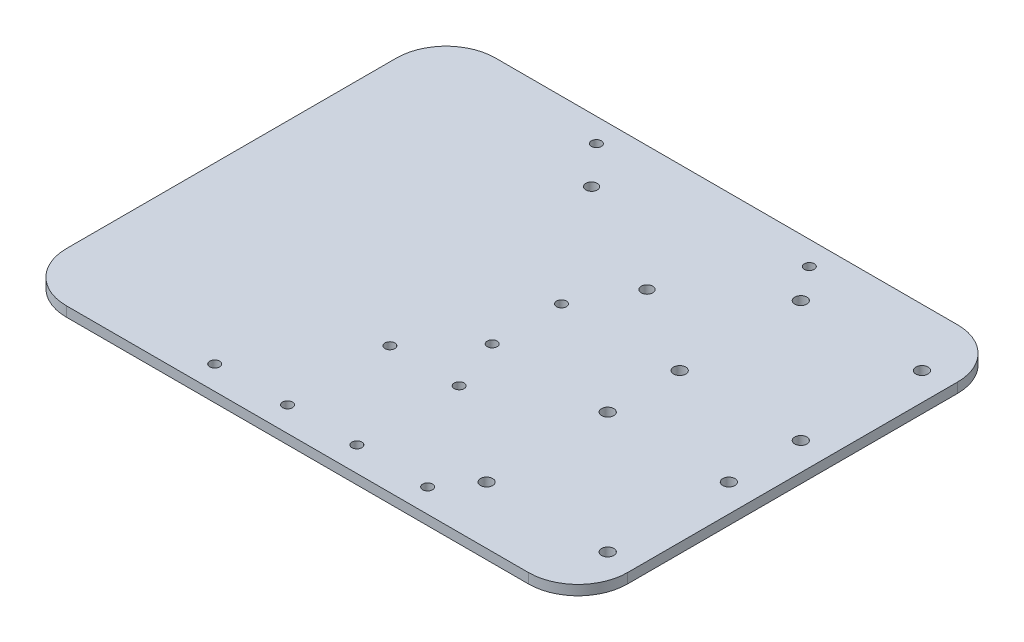
ISO-10303-21;
HEADER;
FILE_DESCRIPTION(('STEP AP214'),'2;1');
FILE_NAME('part.step','',(''),(''),'','','');
FILE_SCHEMA(('AUTOMOTIVE_DESIGN { 1 0 10303 214 1 1 1 1 }'));
ENDSEC;
DATA;
#1=APPLICATION_CONTEXT('core data for automotive mechanical design processes');
#2=APPLICATION_PROTOCOL_DEFINITION('international standard','automotive_design',2000,#1);
#3=PRODUCT_CONTEXT('',#1,'mechanical');
#4=PRODUCT('Part','Part','',(#3));
#5=PRODUCT_RELATED_PRODUCT_CATEGORY('part','',(#4));
#6=PRODUCT_DEFINITION_FORMATION('','',#4);
#7=PRODUCT_DEFINITION_CONTEXT('part definition',#1,'design');
#8=PRODUCT_DEFINITION('design','',#6,#7);
#9=PRODUCT_DEFINITION_SHAPE('','',#8);
#10=(LENGTH_UNIT() NAMED_UNIT(*) SI_UNIT(.MILLI.,.METRE.));
#11=(NAMED_UNIT(*) PLANE_ANGLE_UNIT() SI_UNIT($,.RADIAN.));
#12=(NAMED_UNIT(*) SI_UNIT($,.STERADIAN.) SOLID_ANGLE_UNIT());
#13=UNCERTAINTY_MEASURE_WITH_UNIT(LENGTH_MEASURE(1.E-05),#10,'distance_accuracy_value','');
#14=(GEOMETRIC_REPRESENTATION_CONTEXT(3) GLOBAL_UNCERTAINTY_ASSIGNED_CONTEXT((#13)) GLOBAL_UNIT_ASSIGNED_CONTEXT((#10,
#11,#12)) REPRESENTATION_CONTEXT('',''));
#15=CARTESIAN_POINT('',(0.,0.,0.));
#16=DIRECTION('',(0.,0.,1.));
#17=DIRECTION('',(1.,0.,0.));
#18=AXIS2_PLACEMENT_3D('',#15,#16,#17);
#19=CARTESIAN_POINT('',(85.,3.,65.));
#20=DIRECTION('',(-1.,0.,0.));
#21=DIRECTION('',(0.,0.,1.));
#22=AXIS2_PLACEMENT_3D('',#19,#20,#21);
#23=PLANE('',#22);
#24=DIRECTION('',(0.,0.,-1.));
#25=VECTOR('',#24,1.);
#26=CARTESIAN_POINT('',(85.,3.,65.));
#27=LINE('',#26,#25);
#28=CARTESIAN_POINT('',(85.,3.,50.));
#29=VERTEX_POINT('',#28);
#30=CARTESIAN_POINT('',(85.,3.,-50.));
#31=VERTEX_POINT('',#30);
#32=EDGE_CURVE('E138',#29,#31,#27,.T.);
#33=ORIENTED_EDGE('',*,*,#32,.F.);
#34=DIRECTION('',(0.,-1.,0.));
#35=VECTOR('',#34,1.);
#36=CARTESIAN_POINT('',(85.,3.,50.));
#37=LINE('',#36,#35);
#38=CARTESIAN_POINT('',(85.,0.,50.));
#39=VERTEX_POINT('',#38);
#40=EDGE_CURVE('E177',#29,#39,#37,.T.);
#41=ORIENTED_EDGE('',*,*,#40,.T.);
#42=DIRECTION('',(0.,0.,-1.));
#43=VECTOR('',#42,1.);
#44=CARTESIAN_POINT('',(85.,0.,65.));
#45=LINE('',#44,#43);
#46=CARTESIAN_POINT('',(85.,0.,-50.));
#47=VERTEX_POINT('',#46);
#48=EDGE_CURVE('E192',#39,#47,#45,.T.);
#49=ORIENTED_EDGE('',*,*,#48,.T.);
#50=DIRECTION('',(0.,-1.,0.));
#51=VECTOR('',#50,1.);
#52=CARTESIAN_POINT('',(85.,3.,-50.));
#53=LINE('',#52,#51);
#54=EDGE_CURVE('E174',#47,#31,#53,.F.);
#55=ORIENTED_EDGE('',*,*,#54,.T.);
#56=EDGE_LOOP('',(#33,#41,#49,#55));
#57=FACE_BOUND('',#56,.T.);
#58=ADVANCED_FACE('F42',(#57),#23,.F.);
#59=CARTESIAN_POINT('',(-85.,3.,-65.));
#60=DIRECTION('',(0.,0.,1.));
#61=DIRECTION('',(1.,0.,0.));
#62=AXIS2_PLACEMENT_3D('',#59,#60,#61);
#63=PLANE('',#62);
#64=DIRECTION('',(-1.,0.,0.));
#65=VECTOR('',#64,1.);
#66=CARTESIAN_POINT('',(-85.,3.,-65.));
#67=LINE('',#66,#65);
#68=CARTESIAN_POINT('',(70.,3.,-65.));
#69=VERTEX_POINT('',#68);
#70=CARTESIAN_POINT('',(-70.,3.,-65.));
#71=VERTEX_POINT('',#70);
#72=EDGE_CURVE('E143',#69,#71,#67,.T.);
#73=ORIENTED_EDGE('',*,*,#72,.F.);
#74=DIRECTION('',(0.,-1.,0.));
#75=VECTOR('',#74,1.);
#76=CARTESIAN_POINT('',(70.,3.,-65.));
#77=LINE('',#76,#75);
#78=CARTESIAN_POINT('',(70.,0.,-65.));
#79=VERTEX_POINT('',#78);
#80=EDGE_CURVE('E11',#69,#79,#77,.T.);
#81=ORIENTED_EDGE('',*,*,#80,.T.);
#82=DIRECTION('',(-1.,0.,0.));
#83=VECTOR('',#82,1.);
#84=CARTESIAN_POINT('',(-85.,0.,-65.));
#85=LINE('',#84,#83);
#86=CARTESIAN_POINT('',(-70.,0.,-65.));
#87=VERTEX_POINT('',#86);
#88=EDGE_CURVE('E145',#79,#87,#85,.T.);
#89=ORIENTED_EDGE('',*,*,#88,.T.);
#90=DIRECTION('',(0.,-1.,0.));
#91=VECTOR('',#90,1.);
#92=CARTESIAN_POINT('',(-70.,3.,-65.));
#93=LINE('',#92,#91);
#94=EDGE_CURVE('E51',#87,#71,#93,.F.);
#95=ORIENTED_EDGE('',*,*,#94,.T.);
#96=EDGE_LOOP('',(#73,#81,#89,#95));
#97=FACE_BOUND('',#96,.T.);
#98=ADVANCED_FACE('F198',(#97),#63,.F.);
#99=CARTESIAN_POINT('',(-85.,3.,65.));
#100=DIRECTION('',(1.,0.,0.));
#101=DIRECTION('',(0.,0.,-1.));
#102=AXIS2_PLACEMENT_3D('',#99,#100,#101);
#103=PLANE('',#102);
#104=DIRECTION('',(0.,0.,1.));
#105=VECTOR('',#104,1.);
#106=CARTESIAN_POINT('',(-85.,0.,65.));
#107=LINE('',#106,#105);
#108=CARTESIAN_POINT('',(-85.,0.,-50.));
#109=VERTEX_POINT('',#108);
#110=CARTESIAN_POINT('',(-85.,0.,50.));
#111=VERTEX_POINT('',#110);
#112=EDGE_CURVE('E139',#109,#111,#107,.T.);
#113=ORIENTED_EDGE('',*,*,#112,.T.);
#114=DIRECTION('',(0.,-1.,0.));
#115=VECTOR('',#114,1.);
#116=CARTESIAN_POINT('',(-85.,3.,50.));
#117=LINE('',#116,#115);
#118=CARTESIAN_POINT('',(-85.,3.,50.));
#119=VERTEX_POINT('',#118);
#120=EDGE_CURVE('E114',#111,#119,#117,.F.);
#121=ORIENTED_EDGE('',*,*,#120,.T.);
#122=DIRECTION('',(0.,0.,1.));
#123=VECTOR('',#122,1.);
#124=CARTESIAN_POINT('',(-85.,3.,65.));
#125=LINE('',#124,#123);
#126=CARTESIAN_POINT('',(-85.,3.,-50.));
#127=VERTEX_POINT('',#126);
#128=EDGE_CURVE('E183',#127,#119,#125,.T.);
#129=ORIENTED_EDGE('',*,*,#128,.F.);
#130=DIRECTION('',(0.,-1.,0.));
#131=VECTOR('',#130,1.);
#132=CARTESIAN_POINT('',(-85.,3.,-50.));
#133=LINE('',#132,#131);
#134=EDGE_CURVE('E120',#127,#109,#133,.T.);
#135=ORIENTED_EDGE('',*,*,#134,.T.);
#136=EDGE_LOOP('',(#113,#121,#129,#135));
#137=FACE_BOUND('',#136,.T.);
#138=ADVANCED_FACE('F205',(#137),#103,.F.);
#139=CARTESIAN_POINT('',(-85.,3.,65.));
#140=DIRECTION('',(0.,0.,-1.));
#141=DIRECTION('',(-1.,0.,0.));
#142=AXIS2_PLACEMENT_3D('',#139,#140,#141);
#143=PLANE('',#142);
#144=DIRECTION('',(1.,0.,0.));
#145=VECTOR('',#144,1.);
#146=CARTESIAN_POINT('',(-85.,3.,65.));
#147=LINE('',#146,#145);
#148=CARTESIAN_POINT('',(-70.,3.,65.));
#149=VERTEX_POINT('',#148);
#150=CARTESIAN_POINT('',(70.,3.,65.));
#151=VERTEX_POINT('',#150);
#152=EDGE_CURVE('E130',#149,#151,#147,.T.);
#153=ORIENTED_EDGE('',*,*,#152,.F.);
#154=DIRECTION('',(0.,-1.,0.));
#155=VECTOR('',#154,1.);
#156=CARTESIAN_POINT('',(-70.,3.,65.));
#157=LINE('',#156,#155);
#158=CARTESIAN_POINT('',(-70.,0.,65.));
#159=VERTEX_POINT('',#158);
#160=EDGE_CURVE('E113',#149,#159,#157,.T.);
#161=ORIENTED_EDGE('',*,*,#160,.T.);
#162=DIRECTION('',(1.,0.,0.));
#163=VECTOR('',#162,1.);
#164=CARTESIAN_POINT('',(-85.,0.,65.));
#165=LINE('',#164,#163);
#166=CARTESIAN_POINT('',(70.,0.,65.));
#167=VERTEX_POINT('',#166);
#168=EDGE_CURVE('E127',#159,#167,#165,.T.);
#169=ORIENTED_EDGE('',*,*,#168,.T.);
#170=DIRECTION('',(0.,-1.,0.));
#171=VECTOR('',#170,1.);
#172=CARTESIAN_POINT('',(70.,3.,65.));
#173=LINE('',#172,#171);
#174=EDGE_CURVE('E133',#167,#151,#173,.F.);
#175=ORIENTED_EDGE('',*,*,#174,.T.);
#176=EDGE_LOOP('',(#153,#161,#169,#175));
#177=FACE_BOUND('',#176,.T.);
#178=ADVANCED_FACE('F126',(#177),#143,.F.);
#179=CARTESIAN_POINT('',(0.,3.,0.));
#180=DIRECTION('',(0.,-1.,0.));
#181=DIRECTION('',(0.,0.,-1.));
#182=AXIS2_PLACEMENT_3D('',#179,#180,#181);
#183=PLANE('',#182);
#184=CARTESIAN_POINT('',(-10.5,3.,57.5));
#185=DIRECTION('',(0.,1.,0.));
#186=DIRECTION('',(0.,0.,1.));
#187=AXIS2_PLACEMENT_3D('',#184,#185,#186);
#188=CIRCLE('',#187,1.5);
#189=CARTESIAN_POINT('',(-10.5,3.,59.));
#190=VERTEX_POINT('',#189);
#191=EDGE_CURVE('E561',#190,#190,#188,.T.);
#192=ORIENTED_EDGE('',*,*,#191,.F.);
#193=EDGE_LOOP('',(#192));
#194=FACE_BOUND('',#193,.T.);
#195=CARTESIAN_POINT('',(76.6,3.,10.9));
#196=DIRECTION('',(0.,1.,0.));
#197=DIRECTION('',(0.,0.,1.));
#198=AXIS2_PLACEMENT_3D('',#195,#196,#197);
#199=CIRCLE('',#198,1.84999999999999);
#200=CARTESIAN_POINT('',(76.6,3.,12.75));
#201=VERTEX_POINT('',#200);
#202=EDGE_CURVE('E570',#201,#201,#199,.T.);
#203=ORIENTED_EDGE('',*,*,#202,.F.);
#204=EDGE_LOOP('',(#203));
#205=FACE_BOUND('',#204,.T.);
#206=CARTESIAN_POINT('',(76.6,3.,47.6));
#207=DIRECTION('',(0.,1.,0.));
#208=DIRECTION('',(0.,0.,1.));
#209=AXIS2_PLACEMENT_3D('',#206,#207,#208);
#210=CIRCLE('',#209,1.85);
#211=CARTESIAN_POINT('',(76.6,3.,49.45));
#212=VERTEX_POINT('',#211);
#213=EDGE_CURVE('E583',#212,#212,#210,.T.);
#214=ORIENTED_EDGE('',*,*,#213,.F.);
#215=EDGE_LOOP('',(#214));
#216=FACE_BOUND('',#215,.T.);
#217=CARTESIAN_POINT('',(39.9,3.,47.6));
#218=DIRECTION('',(0.,1.,0.));
#219=DIRECTION('',(0.,0.,1.));
#220=AXIS2_PLACEMENT_3D('',#217,#218,#219);
#221=CIRCLE('',#220,1.85);
#222=CARTESIAN_POINT('',(39.9,3.,49.45));
#223=VERTEX_POINT('',#222);
#224=EDGE_CURVE('E717',#223,#223,#221,.T.);
#225=ORIENTED_EDGE('',*,*,#224,.F.);
#226=EDGE_LOOP('',(#225));
#227=FACE_BOUND('',#226,.T.);
#228=CARTESIAN_POINT('',(10.5,3.,57.5));
#229=DIRECTION('',(0.,1.,0.));
#230=DIRECTION('',(0.,0.,1.));
#231=AXIS2_PLACEMENT_3D('',#228,#229,#230);
#232=CIRCLE('',#231,1.5);
#233=CARTESIAN_POINT('',(10.5,3.,59.));
#234=VERTEX_POINT('',#233);
#235=EDGE_CURVE('E568',#234,#234,#232,.T.);
#236=ORIENTED_EDGE('',*,*,#235,.F.);
#237=EDGE_LOOP('',(#236));
#238=FACE_BOUND('',#237,.T.);
#239=CARTESIAN_POINT('',(10.5,3.,26.5));
#240=DIRECTION('',(0.,1.,0.));
#241=DIRECTION('',(0.,0.,1.));
#242=AXIS2_PLACEMENT_3D('',#239,#240,#241);
#243=CIRCLE('',#242,1.5);
#244=CARTESIAN_POINT('',(10.5,3.,28.));
#245=VERTEX_POINT('',#244);
#246=EDGE_CURVE('E601',#245,#245,#243,.T.);
#247=ORIENTED_EDGE('',*,*,#246,.F.);
#248=EDGE_LOOP('',(#247));
#249=FACE_BOUND('',#248,.T.);
#250=CARTESIAN_POINT('',(-10.5,3.,26.5));
#251=DIRECTION('',(0.,1.,0.));
#252=DIRECTION('',(0.,0.,1.));
#253=AXIS2_PLACEMENT_3D('',#250,#251,#252);
#254=CIRCLE('',#253,1.5);
#255=CARTESIAN_POINT('',(-10.5,3.,28.));
#256=VERTEX_POINT('',#255);
#257=EDGE_CURVE('E593',#256,#256,#254,.T.);
#258=ORIENTED_EDGE('',*,*,#257,.F.);
#259=EDGE_LOOP('',(#258));
#260=FACE_BOUND('',#259,.T.);
#261=CARTESIAN_POINT('',(-21.7,3.,-45.8));
#262=DIRECTION('',(0.,1.,0.));
#263=DIRECTION('',(0.,0.,1.));
#264=AXIS2_PLACEMENT_3D('',#261,#262,#263);
#265=CIRCLE('',#264,1.75);
#266=CARTESIAN_POINT('',(-21.7,3.,-44.05));
#267=VERTEX_POINT('',#266);
#268=EDGE_CURVE('E584',#267,#267,#265,.T.);
#269=ORIENTED_EDGE('',*,*,#268,.F.);
#270=EDGE_LOOP('',(#269));
#271=FACE_BOUND('',#270,.T.);
#272=CARTESIAN_POINT('',(39.9,3.,-10.9));
#273=DIRECTION('',(0.,1.,0.));
#274=DIRECTION('',(0.,0.,1.));
#275=AXIS2_PLACEMENT_3D('',#272,#273,#274);
#276=CIRCLE('',#275,1.85);
#277=CARTESIAN_POINT('',(39.9,3.,-9.05000000000001));
#278=VERTEX_POINT('',#277);
#279=EDGE_CURVE('E686',#278,#278,#276,.T.);
#280=ORIENTED_EDGE('',*,*,#279,.F.);
#281=EDGE_LOOP('',(#280));
#282=FACE_BOUND('',#281,.T.);
#283=CARTESIAN_POINT('',(4.49999999999997,3.,10.5));
#284=DIRECTION('',(0.,1.,0.));
#285=DIRECTION('',(0.,0.,1.));
#286=AXIS2_PLACEMENT_3D('',#283,#284,#285);
#287=CIRCLE('',#286,1.5);
#288=CARTESIAN_POINT('',(4.49999999999997,3.,12.));
#289=VERTEX_POINT('',#288);
#290=EDGE_CURVE('E690',#289,#289,#287,.T.);
#291=ORIENTED_EDGE('',*,*,#290,.F.);
#292=EDGE_LOOP('',(#291));
#293=FACE_BOUND('',#292,.T.);
#294=CARTESIAN_POINT('',(4.49999999999997,3.,-10.5));
#295=DIRECTION('',(0.,1.,0.));
#296=DIRECTION('',(0.,0.,1.));
#297=AXIS2_PLACEMENT_3D('',#294,#295,#296);
#298=CIRCLE('',#297,1.5);
#299=CARTESIAN_POINT('',(4.49999999999997,3.,-8.99999999999999));
#300=VERTEX_POINT('',#299);
#301=EDGE_CURVE('E694',#300,#300,#298,.T.);
#302=ORIENTED_EDGE('',*,*,#301,.F.);
#303=EDGE_LOOP('',(#302));
#304=FACE_BOUND('',#303,.T.);
#305=CARTESIAN_POINT('',(76.6,3.,-10.9));
#306=DIRECTION('',(0.,1.,0.));
#307=DIRECTION('',(0.,0.,1.));
#308=AXIS2_PLACEMENT_3D('',#305,#306,#307);
#309=CIRCLE('',#308,1.85000000000001);
#310=CARTESIAN_POINT('',(76.6,3.,-9.04999999999998));
#311=VERTEX_POINT('',#310);
#312=EDGE_CURVE('E698',#311,#311,#309,.T.);
#313=ORIENTED_EDGE('',*,*,#312,.F.);
#314=EDGE_LOOP('',(#313));
#315=FACE_BOUND('',#314,.T.);
#316=CARTESIAN_POINT('',(76.6,3.,-47.6));
#317=DIRECTION('',(0.,1.,0.));
#318=DIRECTION('',(0.,0.,1.));
#319=AXIS2_PLACEMENT_3D('',#316,#317,#318);
#320=CIRCLE('',#319,1.85);
#321=CARTESIAN_POINT('',(76.6,3.,-45.75));
#322=VERTEX_POINT('',#321);
#323=EDGE_CURVE('E702',#322,#322,#320,.T.);
#324=ORIENTED_EDGE('',*,*,#323,.F.);
#325=EDGE_LOOP('',(#324));
#326=FACE_BOUND('',#325,.T.);
#327=CARTESIAN_POINT('',(39.9,3.,-47.6));
#328=DIRECTION('',(0.,1.,0.));
#329=DIRECTION('',(0.,0.,1.));
#330=AXIS2_PLACEMENT_3D('',#327,#328,#329);
#331=CIRCLE('',#330,1.85000000000001);
#332=CARTESIAN_POINT('',(39.9,3.,-45.75));
#333=VERTEX_POINT('',#332);
#334=EDGE_CURVE('E706',#333,#333,#331,.T.);
#335=ORIENTED_EDGE('',*,*,#334,.F.);
#336=EDGE_LOOP('',(#335));
#337=FACE_BOUND('',#336,.T.);
#338=CARTESIAN_POINT('',(39.9,3.,10.9));
#339=DIRECTION('',(0.,1.,0.));
#340=DIRECTION('',(0.,0.,1.));
#341=AXIS2_PLACEMENT_3D('',#338,#339,#340);
#342=CIRCLE('',#341,1.85);
#343=CARTESIAN_POINT('',(39.9,3.,12.75));
#344=VERTEX_POINT('',#343);
#345=EDGE_CURVE('E709',#344,#344,#342,.T.);
#346=ORIENTED_EDGE('',*,*,#345,.F.);
#347=EDGE_LOOP('',(#346));
#348=FACE_BOUND('',#347,.T.);
#349=CARTESIAN_POINT('',(13.7,3.,-27.2));
#350=DIRECTION('',(0.,1.,0.));
#351=DIRECTION('',(0.,0.,1.));
#352=AXIS2_PLACEMENT_3D('',#349,#350,#351);
#353=CIRCLE('',#352,1.75);
#354=CARTESIAN_POINT('',(13.7,3.,-25.45));
#355=VERTEX_POINT('',#354);
#356=EDGE_CURVE('E588',#355,#355,#353,.T.);
#357=ORIENTED_EDGE('',*,*,#356,.F.);
#358=EDGE_LOOP('',(#357));
#359=FACE_BOUND('',#358,.T.);
#360=CARTESIAN_POINT('',(32.25,3.,57.8167069778438));
#361=DIRECTION('',(0.,-1.,0.));
#362=DIRECTION('',(0.,0.,-1.));
#363=AXIS2_PLACEMENT_3D('',#360,#361,#362);
#364=CIRCLE('',#363,1.5);
#365=CARTESIAN_POINT('',(32.25,3.,56.3167069778438));
#366=VERTEX_POINT('',#365);
#367=EDGE_CURVE('E633',#366,#366,#364,.T.);
#368=ORIENTED_EDGE('',*,*,#367,.T.);
#369=EDGE_LOOP('',(#368));
#370=FACE_BOUND('',#369,.T.);
#371=CARTESIAN_POINT('',(-32.25,3.,-57.8167069778438));
#372=DIRECTION('',(0.,-1.,0.));
#373=DIRECTION('',(0.,0.,-1.));
#374=AXIS2_PLACEMENT_3D('',#371,#372,#373);
#375=CIRCLE('',#374,1.49999999999999);
#376=CARTESIAN_POINT('',(-32.25,3.,-59.3167069778438));
#377=VERTEX_POINT('',#376);
#378=EDGE_CURVE('E624',#377,#377,#375,.T.);
#379=ORIENTED_EDGE('',*,*,#378,.T.);
#380=EDGE_LOOP('',(#379));
#381=FACE_BOUND('',#380,.T.);
#382=CARTESIAN_POINT('',(32.25,3.,-57.8167069778438));
#383=DIRECTION('',(0.,-1.,0.));
#384=DIRECTION('',(0.,0.,-1.));
#385=AXIS2_PLACEMENT_3D('',#382,#383,#384);
#386=CIRCLE('',#385,1.5);
#387=CARTESIAN_POINT('',(32.25,3.,-59.3167069778438));
#388=VERTEX_POINT('',#387);
#389=EDGE_CURVE('E616',#388,#388,#386,.T.);
#390=ORIENTED_EDGE('',*,*,#389,.T.);
#391=EDGE_LOOP('',(#390));
#392=FACE_BOUND('',#391,.T.);
#393=CARTESIAN_POINT('',(-32.25,3.,57.8167069778438));
#394=DIRECTION('',(0.,-1.,0.));
#395=DIRECTION('',(0.,0.,-1.));
#396=AXIS2_PLACEMENT_3D('',#393,#394,#395);
#397=CIRCLE('',#396,1.49999999999999);
#398=CARTESIAN_POINT('',(-32.25,3.,56.3167069778438));
#399=VERTEX_POINT('',#398);
#400=EDGE_CURVE('E195',#399,#399,#397,.T.);
#401=ORIENTED_EDGE('',*,*,#400,.T.);
#402=EDGE_LOOP('',(#401));
#403=FACE_BOUND('',#402,.T.);
#404=ORIENTED_EDGE('',*,*,#128,.T.);
#405=CARTESIAN_POINT('',(-70.,3.,50.));
#406=DIRECTION('',(0.,-1.,0.));
#407=DIRECTION('',(0.,0.,-1.));
#408=AXIS2_PLACEMENT_3D('',#405,#406,#407);
#409=CIRCLE('',#408,15.);
#410=EDGE_CURVE('E171',#119,#149,#409,.F.);
#411=ORIENTED_EDGE('',*,*,#410,.T.);
#412=ORIENTED_EDGE('',*,*,#152,.T.);
#413=CARTESIAN_POINT('',(70.,3.,50.));
#414=DIRECTION('',(0.,-1.,0.));
#415=DIRECTION('',(0.,0.,-1.));
#416=AXIS2_PLACEMENT_3D('',#413,#414,#415);
#417=CIRCLE('',#416,15.);
#418=EDGE_CURVE('E168',#151,#29,#417,.F.);
#419=ORIENTED_EDGE('',*,*,#418,.T.);
#420=ORIENTED_EDGE('',*,*,#32,.T.);
#421=CARTESIAN_POINT('',(70.,3.,-50.));
#422=DIRECTION('',(0.,-1.,0.));
#423=DIRECTION('',(0.,0.,-1.));
#424=AXIS2_PLACEMENT_3D('',#421,#422,#423);
#425=CIRCLE('',#424,15.);
#426=EDGE_CURVE('E64',#31,#69,#425,.F.);
#427=ORIENTED_EDGE('',*,*,#426,.T.);
#428=ORIENTED_EDGE('',*,*,#72,.T.);
#429=CARTESIAN_POINT('',(-70.,3.,-50.));
#430=DIRECTION('',(0.,-1.,0.));
#431=DIRECTION('',(0.,0.,-1.));
#432=AXIS2_PLACEMENT_3D('',#429,#430,#431);
#433=CIRCLE('',#432,15.);
#434=EDGE_CURVE('E163',#71,#127,#433,.F.);
#435=ORIENTED_EDGE('',*,*,#434,.T.);
#436=EDGE_LOOP('',(#404,#411,#412,#419,#420,#427,#428,#435));
#437=FACE_BOUND('',#436,.T.);
#438=ADVANCED_FACE('F203',(#194,#205,#216,#227,#238,#249,#260,#271,#282,#293,#304,#315,#326,
#337,#348,#359,#370,#381,#392,#403,#437),#183,.F.);
#439=CARTESIAN_POINT('',(0.,0.,0.));
#440=DIRECTION('',(0.,-1.,0.));
#441=DIRECTION('',(0.,0.,-1.));
#442=AXIS2_PLACEMENT_3D('',#439,#440,#441);
#443=PLANE('',#442);
#444=CARTESIAN_POINT('',(-10.5,0.,57.5));
#445=DIRECTION('',(0.,1.,0.));
#446=DIRECTION('',(0.,0.,1.));
#447=AXIS2_PLACEMENT_3D('',#444,#445,#446);
#448=CIRCLE('',#447,1.5);
#449=CARTESIAN_POINT('',(-10.5,0.,59.));
#450=VERTEX_POINT('',#449);
#451=EDGE_CURVE('E558',#450,#450,#448,.T.);
#452=ORIENTED_EDGE('',*,*,#451,.T.);
#453=EDGE_LOOP('',(#452));
#454=FACE_BOUND('',#453,.T.);
#455=CARTESIAN_POINT('',(76.6,0.,10.9));
#456=DIRECTION('',(0.,1.,0.));
#457=DIRECTION('',(0.,0.,1.));
#458=AXIS2_PLACEMENT_3D('',#455,#456,#457);
#459=CIRCLE('',#458,1.84999999999999);
#460=CARTESIAN_POINT('',(76.6,0.,12.75));
#461=VERTEX_POINT('',#460);
#462=EDGE_CURVE('E579',#461,#461,#459,.T.);
#463=ORIENTED_EDGE('',*,*,#462,.T.);
#464=EDGE_LOOP('',(#463));
#465=FACE_BOUND('',#464,.T.);
#466=CARTESIAN_POINT('',(76.6,0.,47.6));
#467=DIRECTION('',(0.,1.,0.));
#468=DIRECTION('',(0.,0.,1.));
#469=AXIS2_PLACEMENT_3D('',#466,#467,#468);
#470=CIRCLE('',#469,1.85);
#471=CARTESIAN_POINT('',(76.6,0.,49.45));
#472=VERTEX_POINT('',#471);
#473=EDGE_CURVE('E745',#472,#472,#470,.T.);
#474=ORIENTED_EDGE('',*,*,#473,.T.);
#475=EDGE_LOOP('',(#474));
#476=FACE_BOUND('',#475,.T.);
#477=CARTESIAN_POINT('',(39.9,0.,47.6));
#478=DIRECTION('',(0.,1.,0.));
#479=DIRECTION('',(0.,0.,1.));
#480=AXIS2_PLACEMENT_3D('',#477,#478,#479);
#481=CIRCLE('',#480,1.85);
#482=CARTESIAN_POINT('',(39.9,0.,49.45));
#483=VERTEX_POINT('',#482);
#484=EDGE_CURVE('E573',#483,#483,#481,.T.);
#485=ORIENTED_EDGE('',*,*,#484,.T.);
#486=EDGE_LOOP('',(#485));
#487=FACE_BOUND('',#486,.T.);
#488=CARTESIAN_POINT('',(10.5,0.,57.5));
#489=DIRECTION('',(0.,1.,0.));
#490=DIRECTION('',(0.,0.,1.));
#491=AXIS2_PLACEMENT_3D('',#488,#489,#490);
#492=CIRCLE('',#491,1.5);
#493=CARTESIAN_POINT('',(10.5,0.,59.));
#494=VERTEX_POINT('',#493);
#495=EDGE_CURVE('E563',#494,#494,#492,.T.);
#496=ORIENTED_EDGE('',*,*,#495,.T.);
#497=EDGE_LOOP('',(#496));
#498=FACE_BOUND('',#497,.T.);
#499=CARTESIAN_POINT('',(10.5,0.,26.5));
#500=DIRECTION('',(0.,1.,0.));
#501=DIRECTION('',(0.,0.,1.));
#502=AXIS2_PLACEMENT_3D('',#499,#500,#501);
#503=CIRCLE('',#502,1.5);
#504=CARTESIAN_POINT('',(10.5,0.,28.));
#505=VERTEX_POINT('',#504);
#506=EDGE_CURVE('E605',#505,#505,#503,.T.);
#507=ORIENTED_EDGE('',*,*,#506,.T.);
#508=EDGE_LOOP('',(#507));
#509=FACE_BOUND('',#508,.T.);
#510=CARTESIAN_POINT('',(-10.5,0.,26.5));
#511=DIRECTION('',(0.,1.,0.));
#512=DIRECTION('',(0.,0.,1.));
#513=AXIS2_PLACEMENT_3D('',#510,#511,#512);
#514=CIRCLE('',#513,1.5);
#515=CARTESIAN_POINT('',(-10.5,0.,28.));
#516=VERTEX_POINT('',#515);
#517=EDGE_CURVE('E597',#516,#516,#514,.T.);
#518=ORIENTED_EDGE('',*,*,#517,.T.);
#519=EDGE_LOOP('',(#518));
#520=FACE_BOUND('',#519,.T.);
#521=CARTESIAN_POINT('',(-21.7,0.,-45.8));
#522=DIRECTION('',(0.,1.,0.));
#523=DIRECTION('',(0.,0.,1.));
#524=AXIS2_PLACEMENT_3D('',#521,#522,#523);
#525=CIRCLE('',#524,1.75);
#526=CARTESIAN_POINT('',(-21.7,0.,-44.05));
#527=VERTEX_POINT('',#526);
#528=EDGE_CURVE('E589',#527,#527,#525,.T.);
#529=ORIENTED_EDGE('',*,*,#528,.T.);
#530=EDGE_LOOP('',(#529));
#531=FACE_BOUND('',#530,.T.);
#532=CARTESIAN_POINT('',(39.9,0.,-10.9));
#533=DIRECTION('',(0.,1.,0.));
#534=DIRECTION('',(0.,0.,1.));
#535=AXIS2_PLACEMENT_3D('',#532,#533,#534);
#536=CIRCLE('',#535,1.85);
#537=CARTESIAN_POINT('',(39.9,0.,-9.05000000000001));
#538=VERTEX_POINT('',#537);
#539=EDGE_CURVE('E772',#538,#538,#536,.T.);
#540=ORIENTED_EDGE('',*,*,#539,.T.);
#541=EDGE_LOOP('',(#540));
#542=FACE_BOUND('',#541,.T.);
#543=CARTESIAN_POINT('',(4.49999999999997,0.,10.5));
#544=DIRECTION('',(0.,1.,0.));
#545=DIRECTION('',(0.,0.,1.));
#546=AXIS2_PLACEMENT_3D('',#543,#544,#545);
#547=CIRCLE('',#546,1.5);
#548=CARTESIAN_POINT('',(4.49999999999997,0.,12.));
#549=VERTEX_POINT('',#548);
#550=EDGE_CURVE('E721',#549,#549,#547,.T.);
#551=ORIENTED_EDGE('',*,*,#550,.T.);
#552=EDGE_LOOP('',(#551));
#553=FACE_BOUND('',#552,.T.);
#554=CARTESIAN_POINT('',(4.49999999999997,0.,-10.5));
#555=DIRECTION('',(0.,1.,0.));
#556=DIRECTION('',(0.,0.,1.));
#557=AXIS2_PLACEMENT_3D('',#554,#555,#556);
#558=CIRCLE('',#557,1.5);
#559=CARTESIAN_POINT('',(4.49999999999997,0.,-8.99999999999999));
#560=VERTEX_POINT('',#559);
#561=EDGE_CURVE('E779',#560,#560,#558,.T.);
#562=ORIENTED_EDGE('',*,*,#561,.T.);
#563=EDGE_LOOP('',(#562));
#564=FACE_BOUND('',#563,.T.);
#565=CARTESIAN_POINT('',(76.6,0.,-10.9));
#566=DIRECTION('',(0.,1.,0.));
#567=DIRECTION('',(0.,0.,1.));
#568=AXIS2_PLACEMENT_3D('',#565,#566,#567);
#569=CIRCLE('',#568,1.85000000000001);
#570=CARTESIAN_POINT('',(76.6,0.,-9.04999999999998));
#571=VERTEX_POINT('',#570);
#572=EDGE_CURVE('E738',#571,#571,#569,.T.);
#573=ORIENTED_EDGE('',*,*,#572,.T.);
#574=EDGE_LOOP('',(#573));
#575=FACE_BOUND('',#574,.T.);
#576=CARTESIAN_POINT('',(76.6,0.,-47.6));
#577=DIRECTION('',(0.,1.,0.));
#578=DIRECTION('',(0.,0.,1.));
#579=AXIS2_PLACEMENT_3D('',#576,#577,#578);
#580=CIRCLE('',#579,1.85);
#581=CARTESIAN_POINT('',(76.6,0.,-45.75));
#582=VERTEX_POINT('',#581);
#583=EDGE_CURVE('E732',#582,#582,#580,.T.);
#584=ORIENTED_EDGE('',*,*,#583,.T.);
#585=EDGE_LOOP('',(#584));
#586=FACE_BOUND('',#585,.T.);
#587=CARTESIAN_POINT('',(39.9,0.,-47.6));
#588=DIRECTION('',(0.,1.,0.));
#589=DIRECTION('',(0.,0.,1.));
#590=AXIS2_PLACEMENT_3D('',#587,#588,#589);
#591=CIRCLE('',#590,1.85000000000001);
#592=CARTESIAN_POINT('',(39.9,0.,-45.75));
#593=VERTEX_POINT('',#592);
#594=EDGE_CURVE('E726',#593,#593,#591,.T.);
#595=ORIENTED_EDGE('',*,*,#594,.T.);
#596=EDGE_LOOP('',(#595));
#597=FACE_BOUND('',#596,.T.);
#598=CARTESIAN_POINT('',(39.9,0.,10.9));
#599=DIRECTION('',(0.,1.,0.));
#600=DIRECTION('',(0.,0.,1.));
#601=AXIS2_PLACEMENT_3D('',#598,#599,#600);
#602=CIRCLE('',#601,1.85);
#603=CARTESIAN_POINT('',(39.9,0.,12.75));
#604=VERTEX_POINT('',#603);
#605=EDGE_CURVE('E712',#604,#604,#602,.T.);
#606=ORIENTED_EDGE('',*,*,#605,.T.);
#607=EDGE_LOOP('',(#606));
#608=FACE_BOUND('',#607,.T.);
#609=CARTESIAN_POINT('',(13.7,0.,-27.2));
#610=DIRECTION('',(0.,1.,0.));
#611=DIRECTION('',(0.,0.,1.));
#612=AXIS2_PLACEMENT_3D('',#609,#610,#611);
#613=CIRCLE('',#612,1.75);
#614=CARTESIAN_POINT('',(13.7,0.,-25.45));
#615=VERTEX_POINT('',#614);
#616=EDGE_CURVE('E612',#615,#615,#613,.T.);
#617=ORIENTED_EDGE('',*,*,#616,.T.);
#618=EDGE_LOOP('',(#617));
#619=FACE_BOUND('',#618,.T.);
#620=CARTESIAN_POINT('',(32.25,0.,57.8167069778438));
#621=DIRECTION('',(0.,-1.,0.));
#622=DIRECTION('',(0.,0.,-1.));
#623=AXIS2_PLACEMENT_3D('',#620,#621,#622);
#624=CIRCLE('',#623,1.5);
#625=CARTESIAN_POINT('',(32.25,0.,56.3167069778438));
#626=VERTEX_POINT('',#625);
#627=EDGE_CURVE('E628',#626,#626,#624,.T.);
#628=ORIENTED_EDGE('',*,*,#627,.F.);
#629=EDGE_LOOP('',(#628));
#630=FACE_BOUND('',#629,.T.);
#631=CARTESIAN_POINT('',(-32.25,0.,-57.8167069778438));
#632=DIRECTION('',(0.,-1.,0.));
#633=DIRECTION('',(0.,0.,-1.));
#634=AXIS2_PLACEMENT_3D('',#631,#632,#633);
#635=CIRCLE('',#634,1.49999999999999);
#636=CARTESIAN_POINT('',(-32.25,0.,-59.3167069778438));
#637=VERTEX_POINT('',#636);
#638=EDGE_CURVE('E637',#637,#637,#635,.T.);
#639=ORIENTED_EDGE('',*,*,#638,.F.);
#640=EDGE_LOOP('',(#639));
#641=FACE_BOUND('',#640,.T.);
#642=CARTESIAN_POINT('',(32.25,0.,-57.8167069778438));
#643=DIRECTION('',(0.,-1.,0.));
#644=DIRECTION('',(0.,0.,-1.));
#645=AXIS2_PLACEMENT_3D('',#642,#643,#644);
#646=CIRCLE('',#645,1.5);
#647=CARTESIAN_POINT('',(32.25,0.,-59.3167069778438));
#648=VERTEX_POINT('',#647);
#649=EDGE_CURVE('E620',#648,#648,#646,.T.);
#650=ORIENTED_EDGE('',*,*,#649,.F.);
#651=EDGE_LOOP('',(#650));
#652=FACE_BOUND('',#651,.T.);
#653=CARTESIAN_POINT('',(-32.25,0.,57.8167069778438));
#654=DIRECTION('',(0.,-1.,0.));
#655=DIRECTION('',(0.,0.,-1.));
#656=AXIS2_PLACEMENT_3D('',#653,#654,#655);
#657=CIRCLE('',#656,1.49999999999999);
#658=CARTESIAN_POINT('',(-32.25,0.,56.3167069778438));
#659=VERTEX_POINT('',#658);
#660=EDGE_CURVE('E632',#659,#659,#657,.T.);
#661=ORIENTED_EDGE('',*,*,#660,.F.);
#662=EDGE_LOOP('',(#661));
#663=FACE_BOUND('',#662,.T.);
#664=ORIENTED_EDGE('',*,*,#168,.F.);
#665=CARTESIAN_POINT('',(-70.,0.,50.));
#666=DIRECTION('',(0.,-1.,0.));
#667=DIRECTION('',(0.,0.,-1.));
#668=AXIS2_PLACEMENT_3D('',#665,#666,#667);
#669=CIRCLE('',#668,15.);
#670=EDGE_CURVE('E109',#159,#111,#669,.T.);
#671=ORIENTED_EDGE('',*,*,#670,.T.);
#672=ORIENTED_EDGE('',*,*,#112,.F.);
#673=CARTESIAN_POINT('',(-70.,0.,-50.));
#674=DIRECTION('',(0.,-1.,0.));
#675=DIRECTION('',(0.,0.,-1.));
#676=AXIS2_PLACEMENT_3D('',#673,#674,#675);
#677=CIRCLE('',#676,15.);
#678=EDGE_CURVE('E132',#109,#87,#677,.T.);
#679=ORIENTED_EDGE('',*,*,#678,.T.);
#680=ORIENTED_EDGE('',*,*,#88,.F.);
#681=CARTESIAN_POINT('',(70.,0.,-50.));
#682=DIRECTION('',(0.,-1.,0.));
#683=DIRECTION('',(0.,0.,-1.));
#684=AXIS2_PLACEMENT_3D('',#681,#682,#683);
#685=CIRCLE('',#684,15.);
#686=EDGE_CURVE('E153',#79,#47,#685,.T.);
#687=ORIENTED_EDGE('',*,*,#686,.T.);
#688=ORIENTED_EDGE('',*,*,#48,.F.);
#689=CARTESIAN_POINT('',(70.,0.,50.));
#690=DIRECTION('',(0.,-1.,0.));
#691=DIRECTION('',(0.,0.,-1.));
#692=AXIS2_PLACEMENT_3D('',#689,#690,#691);
#693=CIRCLE('',#692,15.);
#694=EDGE_CURVE('E121',#39,#167,#693,.T.);
#695=ORIENTED_EDGE('',*,*,#694,.T.);
#696=EDGE_LOOP('',(#664,#671,#672,#679,#680,#687,#688,#695));
#697=FACE_BOUND('',#696,.T.);
#698=ADVANCED_FACE('F135',(#454,#465,#476,#487,#498,#509,#520,#531,#542,#553,#564,#575,#586,
#597,#608,#619,#630,#641,#652,#663,#697),#443,.T.);
#699=CARTESIAN_POINT('',(-32.25,3.,57.8167069778438));
#700=DIRECTION('',(0.,-1.,0.));
#701=DIRECTION('',(0.,0.,-1.));
#702=AXIS2_PLACEMENT_3D('',#699,#700,#701);
#703=CYLINDRICAL_SURFACE('',#702,1.49999999999999);
#704=ORIENTED_EDGE('',*,*,#400,.F.);
#705=EDGE_LOOP('',(#704));
#706=FACE_BOUND('',#705,.T.);
#707=ORIENTED_EDGE('',*,*,#660,.T.);
#708=EDGE_LOOP('',(#707));
#709=FACE_BOUND('',#708,.T.);
#710=ADVANCED_FACE('F269',(#706,#709),#703,.F.);
#711=CARTESIAN_POINT('',(32.25,3.,-57.8167069778438));
#712=DIRECTION('',(0.,-1.,0.));
#713=DIRECTION('',(0.,0.,-1.));
#714=AXIS2_PLACEMENT_3D('',#711,#712,#713);
#715=CYLINDRICAL_SURFACE('',#714,1.5);
#716=ORIENTED_EDGE('',*,*,#389,.F.);
#717=EDGE_LOOP('',(#716));
#718=FACE_BOUND('',#717,.T.);
#719=ORIENTED_EDGE('',*,*,#649,.T.);
#720=EDGE_LOOP('',(#719));
#721=FACE_BOUND('',#720,.T.);
#722=ADVANCED_FACE('F321',(#718,#721),#715,.F.);
#723=CARTESIAN_POINT('',(-32.25,3.,-57.8167069778438));
#724=DIRECTION('',(0.,-1.,0.));
#725=DIRECTION('',(0.,0.,-1.));
#726=AXIS2_PLACEMENT_3D('',#723,#724,#725);
#727=CYLINDRICAL_SURFACE('',#726,1.49999999999999);
#728=ORIENTED_EDGE('',*,*,#378,.F.);
#729=EDGE_LOOP('',(#728));
#730=FACE_BOUND('',#729,.T.);
#731=ORIENTED_EDGE('',*,*,#638,.T.);
#732=EDGE_LOOP('',(#731));
#733=FACE_BOUND('',#732,.T.);
#734=ADVANCED_FACE('F331',(#730,#733),#727,.F.);
#735=CARTESIAN_POINT('',(32.25,3.,57.8167069778438));
#736=DIRECTION('',(0.,-1.,0.));
#737=DIRECTION('',(0.,0.,-1.));
#738=AXIS2_PLACEMENT_3D('',#735,#736,#737);
#739=CYLINDRICAL_SURFACE('',#738,1.5);
#740=ORIENTED_EDGE('',*,*,#367,.F.);
#741=EDGE_LOOP('',(#740));
#742=FACE_BOUND('',#741,.T.);
#743=ORIENTED_EDGE('',*,*,#627,.T.);
#744=EDGE_LOOP('',(#743));
#745=FACE_BOUND('',#744,.T.);
#746=ADVANCED_FACE('F341',(#742,#745),#739,.F.);
#747=CARTESIAN_POINT('',(13.7,0.,-27.2));
#748=DIRECTION('',(0.,1.,0.));
#749=DIRECTION('',(0.,0.,1.));
#750=AXIS2_PLACEMENT_3D('',#747,#748,#749);
#751=CYLINDRICAL_SURFACE('',#750,1.75);
#752=ORIENTED_EDGE('',*,*,#616,.F.);
#753=EDGE_LOOP('',(#752));
#754=FACE_BOUND('',#753,.T.);
#755=ORIENTED_EDGE('',*,*,#356,.T.);
#756=EDGE_LOOP('',(#755));
#757=FACE_BOUND('',#756,.T.);
#758=ADVANCED_FACE('F351',(#754,#757),#751,.F.);
#759=CARTESIAN_POINT('',(39.9,0.,10.9));
#760=DIRECTION('',(0.,1.,0.));
#761=DIRECTION('',(0.,0.,1.));
#762=AXIS2_PLACEMENT_3D('',#759,#760,#761);
#763=CYLINDRICAL_SURFACE('',#762,1.85);
#764=ORIENTED_EDGE('',*,*,#605,.F.);
#765=EDGE_LOOP('',(#764));
#766=FACE_BOUND('',#765,.T.);
#767=ORIENTED_EDGE('',*,*,#345,.T.);
#768=EDGE_LOOP('',(#767));
#769=FACE_BOUND('',#768,.T.);
#770=ADVANCED_FACE('F361',(#766,#769),#763,.F.);
#771=CARTESIAN_POINT('',(39.9,0.,-47.6));
#772=DIRECTION('',(0.,1.,0.));
#773=DIRECTION('',(0.,0.,1.));
#774=AXIS2_PLACEMENT_3D('',#771,#772,#773);
#775=CYLINDRICAL_SURFACE('',#774,1.85000000000001);
#776=ORIENTED_EDGE('',*,*,#594,.F.);
#777=EDGE_LOOP('',(#776));
#778=FACE_BOUND('',#777,.T.);
#779=ORIENTED_EDGE('',*,*,#334,.T.);
#780=EDGE_LOOP('',(#779));
#781=FACE_BOUND('',#780,.T.);
#782=ADVANCED_FACE('F371',(#778,#781),#775,.F.);
#783=CARTESIAN_POINT('',(76.6,0.,-47.6));
#784=DIRECTION('',(0.,1.,0.));
#785=DIRECTION('',(0.,0.,1.));
#786=AXIS2_PLACEMENT_3D('',#783,#784,#785);
#787=CYLINDRICAL_SURFACE('',#786,1.85);
#788=ORIENTED_EDGE('',*,*,#583,.F.);
#789=EDGE_LOOP('',(#788));
#790=FACE_BOUND('',#789,.T.);
#791=ORIENTED_EDGE('',*,*,#323,.T.);
#792=EDGE_LOOP('',(#791));
#793=FACE_BOUND('',#792,.T.);
#794=ADVANCED_FACE('F381',(#790,#793),#787,.F.);
#795=CARTESIAN_POINT('',(76.6,0.,-10.9));
#796=DIRECTION('',(0.,1.,0.));
#797=DIRECTION('',(0.,0.,1.));
#798=AXIS2_PLACEMENT_3D('',#795,#796,#797);
#799=CYLINDRICAL_SURFACE('',#798,1.85000000000001);
#800=ORIENTED_EDGE('',*,*,#572,.F.);
#801=EDGE_LOOP('',(#800));
#802=FACE_BOUND('',#801,.T.);
#803=ORIENTED_EDGE('',*,*,#312,.T.);
#804=EDGE_LOOP('',(#803));
#805=FACE_BOUND('',#804,.T.);
#806=ADVANCED_FACE('F391',(#802,#805),#799,.F.);
#807=CARTESIAN_POINT('',(4.49999999999997,0.,-10.5));
#808=DIRECTION('',(0.,1.,0.));
#809=DIRECTION('',(0.,0.,1.));
#810=AXIS2_PLACEMENT_3D('',#807,#808,#809);
#811=CYLINDRICAL_SURFACE('',#810,1.5);
#812=ORIENTED_EDGE('',*,*,#561,.F.);
#813=EDGE_LOOP('',(#812));
#814=FACE_BOUND('',#813,.T.);
#815=ORIENTED_EDGE('',*,*,#301,.T.);
#816=EDGE_LOOP('',(#815));
#817=FACE_BOUND('',#816,.T.);
#818=ADVANCED_FACE('F401',(#814,#817),#811,.F.);
#819=CARTESIAN_POINT('',(4.49999999999997,0.,10.5));
#820=DIRECTION('',(0.,1.,0.));
#821=DIRECTION('',(0.,0.,1.));
#822=AXIS2_PLACEMENT_3D('',#819,#820,#821);
#823=CYLINDRICAL_SURFACE('',#822,1.5);
#824=ORIENTED_EDGE('',*,*,#550,.F.);
#825=EDGE_LOOP('',(#824));
#826=FACE_BOUND('',#825,.T.);
#827=ORIENTED_EDGE('',*,*,#290,.T.);
#828=EDGE_LOOP('',(#827));
#829=FACE_BOUND('',#828,.T.);
#830=ADVANCED_FACE('F411',(#826,#829),#823,.F.);
#831=CARTESIAN_POINT('',(39.9,0.,-10.9));
#832=DIRECTION('',(0.,1.,0.));
#833=DIRECTION('',(0.,0.,1.));
#834=AXIS2_PLACEMENT_3D('',#831,#832,#833);
#835=CYLINDRICAL_SURFACE('',#834,1.85);
#836=ORIENTED_EDGE('',*,*,#539,.F.);
#837=EDGE_LOOP('',(#836));
#838=FACE_BOUND('',#837,.T.);
#839=ORIENTED_EDGE('',*,*,#279,.T.);
#840=EDGE_LOOP('',(#839));
#841=FACE_BOUND('',#840,.T.);
#842=ADVANCED_FACE('F421',(#838,#841),#835,.F.);
#843=CARTESIAN_POINT('',(-21.7,0.,-45.8));
#844=DIRECTION('',(0.,1.,0.));
#845=DIRECTION('',(0.,0.,1.));
#846=AXIS2_PLACEMENT_3D('',#843,#844,#845);
#847=CYLINDRICAL_SURFACE('',#846,1.75);
#848=ORIENTED_EDGE('',*,*,#528,.F.);
#849=EDGE_LOOP('',(#848));
#850=FACE_BOUND('',#849,.T.);
#851=ORIENTED_EDGE('',*,*,#268,.T.);
#852=EDGE_LOOP('',(#851));
#853=FACE_BOUND('',#852,.T.);
#854=ADVANCED_FACE('F431',(#850,#853),#847,.F.);
#855=CARTESIAN_POINT('',(-10.5,0.,26.5));
#856=DIRECTION('',(0.,1.,0.));
#857=DIRECTION('',(0.,0.,1.));
#858=AXIS2_PLACEMENT_3D('',#855,#856,#857);
#859=CYLINDRICAL_SURFACE('',#858,1.5);
#860=ORIENTED_EDGE('',*,*,#517,.F.);
#861=EDGE_LOOP('',(#860));
#862=FACE_BOUND('',#861,.T.);
#863=ORIENTED_EDGE('',*,*,#257,.T.);
#864=EDGE_LOOP('',(#863));
#865=FACE_BOUND('',#864,.T.);
#866=ADVANCED_FACE('F441',(#862,#865),#859,.F.);
#867=CARTESIAN_POINT('',(10.5,0.,26.5));
#868=DIRECTION('',(0.,1.,0.));
#869=DIRECTION('',(0.,0.,1.));
#870=AXIS2_PLACEMENT_3D('',#867,#868,#869);
#871=CYLINDRICAL_SURFACE('',#870,1.5);
#872=ORIENTED_EDGE('',*,*,#506,.F.);
#873=EDGE_LOOP('',(#872));
#874=FACE_BOUND('',#873,.T.);
#875=ORIENTED_EDGE('',*,*,#246,.T.);
#876=EDGE_LOOP('',(#875));
#877=FACE_BOUND('',#876,.T.);
#878=ADVANCED_FACE('F451',(#874,#877),#871,.F.);
#879=CARTESIAN_POINT('',(10.5,0.,57.5));
#880=DIRECTION('',(0.,1.,0.));
#881=DIRECTION('',(0.,0.,1.));
#882=AXIS2_PLACEMENT_3D('',#879,#880,#881);
#883=CYLINDRICAL_SURFACE('',#882,1.5);
#884=ORIENTED_EDGE('',*,*,#495,.F.);
#885=EDGE_LOOP('',(#884));
#886=FACE_BOUND('',#885,.T.);
#887=ORIENTED_EDGE('',*,*,#235,.T.);
#888=EDGE_LOOP('',(#887));
#889=FACE_BOUND('',#888,.T.);
#890=ADVANCED_FACE('F461',(#886,#889),#883,.F.);
#891=CARTESIAN_POINT('',(39.9,0.,47.6));
#892=DIRECTION('',(0.,1.,0.));
#893=DIRECTION('',(0.,0.,1.));
#894=AXIS2_PLACEMENT_3D('',#891,#892,#893);
#895=CYLINDRICAL_SURFACE('',#894,1.85);
#896=ORIENTED_EDGE('',*,*,#484,.F.);
#897=EDGE_LOOP('',(#896));
#898=FACE_BOUND('',#897,.T.);
#899=ORIENTED_EDGE('',*,*,#224,.T.);
#900=EDGE_LOOP('',(#899));
#901=FACE_BOUND('',#900,.T.);
#902=ADVANCED_FACE('F471',(#898,#901),#895,.F.);
#903=CARTESIAN_POINT('',(76.6,0.,47.6));
#904=DIRECTION('',(0.,1.,0.));
#905=DIRECTION('',(0.,0.,1.));
#906=AXIS2_PLACEMENT_3D('',#903,#904,#905);
#907=CYLINDRICAL_SURFACE('',#906,1.85);
#908=ORIENTED_EDGE('',*,*,#473,.F.);
#909=EDGE_LOOP('',(#908));
#910=FACE_BOUND('',#909,.T.);
#911=ORIENTED_EDGE('',*,*,#213,.T.);
#912=EDGE_LOOP('',(#911));
#913=FACE_BOUND('',#912,.T.);
#914=ADVANCED_FACE('F481',(#910,#913),#907,.F.);
#915=CARTESIAN_POINT('',(76.6,0.,10.9));
#916=DIRECTION('',(0.,1.,0.));
#917=DIRECTION('',(0.,0.,1.));
#918=AXIS2_PLACEMENT_3D('',#915,#916,#917);
#919=CYLINDRICAL_SURFACE('',#918,1.84999999999999);
#920=ORIENTED_EDGE('',*,*,#462,.F.);
#921=EDGE_LOOP('',(#920));
#922=FACE_BOUND('',#921,.T.);
#923=ORIENTED_EDGE('',*,*,#202,.T.);
#924=EDGE_LOOP('',(#923));
#925=FACE_BOUND('',#924,.T.);
#926=ADVANCED_FACE('F491',(#922,#925),#919,.F.);
#927=CARTESIAN_POINT('',(-10.5,0.,57.5));
#928=DIRECTION('',(0.,1.,0.));
#929=DIRECTION('',(0.,0.,1.));
#930=AXIS2_PLACEMENT_3D('',#927,#928,#929);
#931=CYLINDRICAL_SURFACE('',#930,1.5);
#932=ORIENTED_EDGE('',*,*,#451,.F.);
#933=EDGE_LOOP('',(#932));
#934=FACE_BOUND('',#933,.T.);
#935=ORIENTED_EDGE('',*,*,#191,.T.);
#936=EDGE_LOOP('',(#935));
#937=FACE_BOUND('',#936,.T.);
#938=ADVANCED_FACE('F225',(#934,#937),#931,.F.);
#939=CARTESIAN_POINT('',(-70.,3.,50.));
#940=DIRECTION('',(0.,-1.,0.));
#941=DIRECTION('',(0.,0.,-1.));
#942=AXIS2_PLACEMENT_3D('',#939,#940,#941);
#943=CYLINDRICAL_SURFACE('',#942,15.);
#944=ORIENTED_EDGE('',*,*,#410,.F.);
#945=ORIENTED_EDGE('',*,*,#120,.F.);
#946=ORIENTED_EDGE('',*,*,#670,.F.);
#947=ORIENTED_EDGE('',*,*,#160,.F.);
#948=EDGE_LOOP('',(#944,#945,#946,#947));
#949=FACE_BOUND('',#948,.T.);
#950=ADVANCED_FACE('F112',(#949),#943,.T.);
#951=CARTESIAN_POINT('',(70.,3.,50.));
#952=DIRECTION('',(0.,-1.,0.));
#953=DIRECTION('',(0.,0.,-1.));
#954=AXIS2_PLACEMENT_3D('',#951,#952,#953);
#955=CYLINDRICAL_SURFACE('',#954,15.);
#956=ORIENTED_EDGE('',*,*,#418,.F.);
#957=ORIENTED_EDGE('',*,*,#174,.F.);
#958=ORIENTED_EDGE('',*,*,#694,.F.);
#959=ORIENTED_EDGE('',*,*,#40,.F.);
#960=EDGE_LOOP('',(#956,#957,#958,#959));
#961=FACE_BOUND('',#960,.T.);
#962=ADVANCED_FACE('F224',(#961),#955,.T.);
#963=CARTESIAN_POINT('',(70.,3.,-50.));
#964=DIRECTION('',(0.,-1.,0.));
#965=DIRECTION('',(0.,0.,-1.));
#966=AXIS2_PLACEMENT_3D('',#963,#964,#965);
#967=CYLINDRICAL_SURFACE('',#966,15.);
#968=ORIENTED_EDGE('',*,*,#426,.F.);
#969=ORIENTED_EDGE('',*,*,#54,.F.);
#970=ORIENTED_EDGE('',*,*,#686,.F.);
#971=ORIENTED_EDGE('',*,*,#80,.F.);
#972=EDGE_LOOP('',(#968,#969,#970,#971));
#973=FACE_BOUND('',#972,.T.);
#974=ADVANCED_FACE('F227',(#973),#967,.T.);
#975=CARTESIAN_POINT('',(-70.,3.,-50.));
#976=DIRECTION('',(0.,-1.,0.));
#977=DIRECTION('',(0.,0.,-1.));
#978=AXIS2_PLACEMENT_3D('',#975,#976,#977);
#979=CYLINDRICAL_SURFACE('',#978,15.);
#980=ORIENTED_EDGE('',*,*,#434,.F.);
#981=ORIENTED_EDGE('',*,*,#94,.F.);
#982=ORIENTED_EDGE('',*,*,#678,.F.);
#983=ORIENTED_EDGE('',*,*,#134,.F.);
#984=EDGE_LOOP('',(#980,#981,#982,#983));
#985=FACE_BOUND('',#984,.T.);
#986=ADVANCED_FACE('F44',(#985),#979,.T.);
#987=CLOSED_SHELL('',(#58,#98,#138,#178,#438,#698,#710,#722,#734,#746,#758,#770,#782,#794,#806,
#818,#830,#842,#854,#866,#878,#890,#902,#914,#926,#938,#950,#962,#974,#986));
#988=MANIFOLD_SOLID_BREP('B2',#987);
#989=ADVANCED_BREP_SHAPE_REPRESENTATION('',(#18,#988),#14);
#990=SHAPE_DEFINITION_REPRESENTATION(#9,#989);
ENDSEC;
END-ISO-10303-21;
